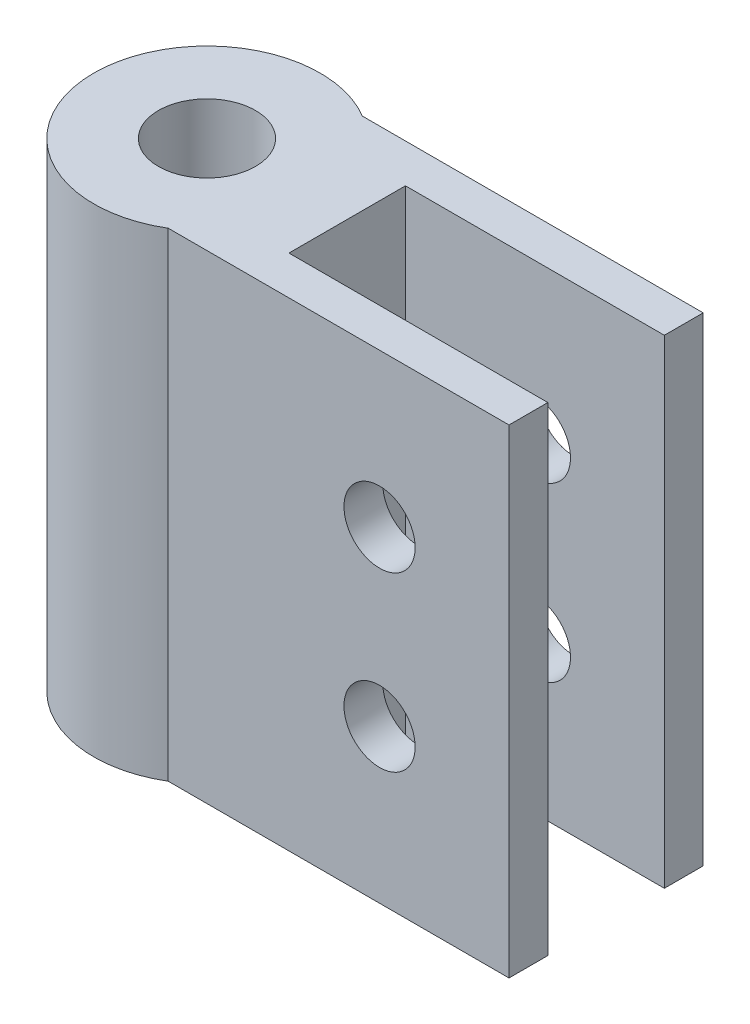
ISO-10303-21;
HEADER;
FILE_DESCRIPTION(('STEP AP214'),'2;1');
FILE_NAME('part.step','',(''),(''),'','','');
FILE_SCHEMA(('AUTOMOTIVE_DESIGN { 1 0 10303 214 1 1 1 1 }'));
ENDSEC;
DATA;
#1=APPLICATION_CONTEXT('core data for automotive mechanical design processes');
#2=APPLICATION_PROTOCOL_DEFINITION('international standard','automotive_design',2000,#1);
#3=PRODUCT_CONTEXT('',#1,'mechanical');
#4=PRODUCT('Part','Part','',(#3));
#5=PRODUCT_RELATED_PRODUCT_CATEGORY('part','',(#4));
#6=PRODUCT_DEFINITION_FORMATION('','',#4);
#7=PRODUCT_DEFINITION_CONTEXT('part definition',#1,'design');
#8=PRODUCT_DEFINITION('design','',#6,#7);
#9=PRODUCT_DEFINITION_SHAPE('','',#8);
#10=(LENGTH_UNIT() NAMED_UNIT(*) SI_UNIT(.MILLI.,.METRE.));
#11=(NAMED_UNIT(*) PLANE_ANGLE_UNIT() SI_UNIT($,.RADIAN.));
#12=(NAMED_UNIT(*) SI_UNIT($,.STERADIAN.) SOLID_ANGLE_UNIT());
#13=UNCERTAINTY_MEASURE_WITH_UNIT(LENGTH_MEASURE(1.E-05),#10,'distance_accuracy_value','');
#14=(GEOMETRIC_REPRESENTATION_CONTEXT(3) GLOBAL_UNCERTAINTY_ASSIGNED_CONTEXT((#13)) GLOBAL_UNIT_ASSIGNED_CONTEXT((#10,
#11,#12)) REPRESENTATION_CONTEXT('',''));
#15=CARTESIAN_POINT('',(0.,0.,0.));
#16=DIRECTION('',(0.,0.,1.));
#17=DIRECTION('',(1.,0.,0.));
#18=AXIS2_PLACEMENT_3D('',#15,#16,#17);
#19=CARTESIAN_POINT('',(18.5,-18.3575597506858,4.5));
#20=DIRECTION('',(1.,0.,0.));
#21=DIRECTION('',(0.,0.,-1.));
#22=AXIS2_PLACEMENT_3D('',#19,#20,#21);
#23=PLANE('',#22);
#24=DIRECTION('',(0.,1.,0.));
#25=VECTOR('',#24,1.);
#26=CARTESIAN_POINT('',(18.5,0.,2.7));
#27=LINE('',#26,#25);
#28=CARTESIAN_POINT('',(18.5,0.,2.7));
#29=VERTEX_POINT('',#28);
#30=CARTESIAN_POINT('',(18.5,22.2,2.7));
#31=VERTEX_POINT('',#30);
#32=EDGE_CURVE('E138',#29,#31,#27,.T.);
#33=ORIENTED_EDGE('',*,*,#32,.T.);
#34=DIRECTION('',(0.,0.,-1.));
#35=VECTOR('',#34,1.);
#36=CARTESIAN_POINT('',(18.5,22.2,4.5));
#37=LINE('',#36,#35);
#38=CARTESIAN_POINT('',(18.5,22.2,4.5));
#39=VERTEX_POINT('',#38);
#40=EDGE_CURVE('E151',#39,#31,#37,.T.);
#41=ORIENTED_EDGE('',*,*,#40,.F.);
#42=DIRECTION('',(0.,1.,0.));
#43=VECTOR('',#42,1.);
#44=CARTESIAN_POINT('',(18.5,-18.3575597506858,4.5));
#45=LINE('',#44,#43);
#46=CARTESIAN_POINT('',(18.5,0.,4.5));
#47=VERTEX_POINT('',#46);
#48=EDGE_CURVE('E157',#47,#39,#45,.T.);
#49=ORIENTED_EDGE('',*,*,#48,.F.);
#50=DIRECTION('',(0.,0.,1.));
#51=VECTOR('',#50,1.);
#52=CARTESIAN_POINT('',(18.5,0.,4.5));
#53=LINE('',#52,#51);
#54=EDGE_CURVE('E146',#29,#47,#53,.T.);
#55=ORIENTED_EDGE('',*,*,#54,.F.);
#56=EDGE_LOOP('',(#33,#41,#49,#55));
#57=FACE_BOUND('',#56,.T.);
#58=ADVANCED_FACE('F39',(#57),#23,.T.);
#59=CARTESIAN_POINT('',(0.,22.2,0.));
#60=DIRECTION('',(0.,1.,0.));
#61=DIRECTION('',(0.,0.,1.));
#62=AXIS2_PLACEMENT_3D('',#59,#60,#61);
#63=PLANE('',#62);
#64=DIRECTION('',(1.,0.,0.));
#65=VECTOR('',#64,1.);
#66=CARTESIAN_POINT('',(6.5,22.2,2.7));
#67=LINE('',#66,#65);
#68=CARTESIAN_POINT('',(6.5,22.2,2.7));
#69=VERTEX_POINT('',#68);
#70=EDGE_CURVE('E127',#69,#31,#67,.T.);
#71=ORIENTED_EDGE('',*,*,#70,.F.);
#72=DIRECTION('',(0.,0.,1.));
#73=VECTOR('',#72,1.);
#74=CARTESIAN_POINT('',(6.5,22.2,2.7));
#75=LINE('',#74,#73);
#76=CARTESIAN_POINT('',(6.5,22.2,-2.7));
#77=VERTEX_POINT('',#76);
#78=EDGE_CURVE('E129',#77,#69,#75,.T.);
#79=ORIENTED_EDGE('',*,*,#78,.F.);
#80=DIRECTION('',(-1.,0.,0.));
#81=VECTOR('',#80,1.);
#82=CARTESIAN_POINT('',(6.5,22.2,-2.7));
#83=LINE('',#82,#81);
#84=CARTESIAN_POINT('',(18.5,22.2,-2.7));
#85=VERTEX_POINT('',#84);
#86=EDGE_CURVE('E107',#85,#77,#83,.T.);
#87=ORIENTED_EDGE('',*,*,#86,.F.);
#88=CARTESIAN_POINT('',(18.5,22.2,-4.5));
#89=VERTEX_POINT('',#88);
#90=EDGE_CURVE('E150',#85,#89,#37,.T.);
#91=ORIENTED_EDGE('',*,*,#90,.T.);
#92=DIRECTION('',(-1.,0.,0.));
#93=VECTOR('',#92,1.);
#94=CARTESIAN_POINT('',(18.5,22.2,-4.5));
#95=LINE('',#94,#93);
#96=CARTESIAN_POINT('',(2.70416345659799,22.2,-4.5));
#97=VERTEX_POINT('',#96);
#98=EDGE_CURVE('E154',#89,#97,#95,.T.);
#99=ORIENTED_EDGE('',*,*,#98,.T.);
#100=CARTESIAN_POINT('',(0.,22.2,0.));
#101=DIRECTION('',(0.,1.,0.));
#102=DIRECTION('',(0.,0.,1.));
#103=AXIS2_PLACEMENT_3D('',#100,#101,#102);
#104=CIRCLE('',#103,5.25);
#105=CARTESIAN_POINT('',(2.70416345659799,22.2,4.5));
#106=VERTEX_POINT('',#105);
#107=EDGE_CURVE('E171',#97,#106,#104,.T.);
#108=ORIENTED_EDGE('',*,*,#107,.T.);
#109=DIRECTION('',(1.,0.,0.));
#110=VECTOR('',#109,1.);
#111=CARTESIAN_POINT('',(18.5,22.2,4.5));
#112=LINE('',#111,#110);
#113=EDGE_CURVE('E141',#106,#39,#112,.T.);
#114=ORIENTED_EDGE('',*,*,#113,.T.);
#115=ORIENTED_EDGE('',*,*,#40,.T.);
#116=EDGE_LOOP('',(#71,#79,#87,#91,#99,#108,#114,#115));
#117=FACE_BOUND('',#116,.T.);
#118=CARTESIAN_POINT('',(0.,22.2,0.));
#119=DIRECTION('',(0.,1.,0.));
#120=DIRECTION('',(0.,0.,1.));
#121=AXIS2_PLACEMENT_3D('',#118,#119,#120);
#122=CIRCLE('',#121,2.25);
#123=CARTESIAN_POINT('',(0.,22.2,2.25));
#124=VERTEX_POINT('',#123);
#125=EDGE_CURVE('E166',#124,#124,#122,.T.);
#126=ORIENTED_EDGE('',*,*,#125,.F.);
#127=EDGE_LOOP('',(#126));
#128=FACE_BOUND('',#127,.T.);
#129=ADVANCED_FACE('F218',(#117,#128),#63,.T.);
#130=CARTESIAN_POINT('',(0.,0.,0.));
#131=DIRECTION('',(0.,1.,0.));
#132=DIRECTION('',(0.,0.,1.));
#133=AXIS2_PLACEMENT_3D('',#130,#131,#132);
#134=PLANE('',#133);
#135=DIRECTION('',(0.,0.,1.));
#136=VECTOR('',#135,1.);
#137=CARTESIAN_POINT('',(6.5,0.,2.7));
#138=LINE('',#137,#136);
#139=CARTESIAN_POINT('',(6.5,0.,-2.7));
#140=VERTEX_POINT('',#139);
#141=CARTESIAN_POINT('',(6.5,0.,2.7));
#142=VERTEX_POINT('',#141);
#143=EDGE_CURVE('E115',#140,#142,#138,.T.);
#144=ORIENTED_EDGE('',*,*,#143,.T.);
#145=DIRECTION('',(1.,0.,0.));
#146=VECTOR('',#145,1.);
#147=CARTESIAN_POINT('',(6.5,0.,2.7));
#148=LINE('',#147,#146);
#149=EDGE_CURVE('E120',#142,#29,#148,.T.);
#150=ORIENTED_EDGE('',*,*,#149,.T.);
#151=ORIENTED_EDGE('',*,*,#54,.T.);
#152=DIRECTION('',(-1.,0.,0.));
#153=VECTOR('',#152,1.);
#154=CARTESIAN_POINT('',(18.5,0.,4.5));
#155=LINE('',#154,#153);
#156=CARTESIAN_POINT('',(2.70416345659799,0.,4.5));
#157=VERTEX_POINT('',#156);
#158=EDGE_CURVE('E148',#47,#157,#155,.T.);
#159=ORIENTED_EDGE('',*,*,#158,.T.);
#160=CARTESIAN_POINT('',(0.,0.,0.));
#161=DIRECTION('',(0.,1.,0.));
#162=DIRECTION('',(0.,0.,1.));
#163=AXIS2_PLACEMENT_3D('',#160,#161,#162);
#164=CIRCLE('',#163,5.25);
#165=CARTESIAN_POINT('',(2.70416345659799,0.,-4.5));
#166=VERTEX_POINT('',#165);
#167=EDGE_CURVE('E63',#166,#157,#164,.T.);
#168=ORIENTED_EDGE('',*,*,#167,.F.);
#169=DIRECTION('',(1.,0.,0.));
#170=VECTOR('',#169,1.);
#171=CARTESIAN_POINT('',(18.5,0.,-4.5));
#172=LINE('',#171,#170);
#173=CARTESIAN_POINT('',(18.5,0.,-4.5));
#174=VERTEX_POINT('',#173);
#175=EDGE_CURVE('E145',#166,#174,#172,.T.);
#176=ORIENTED_EDGE('',*,*,#175,.T.);
#177=CARTESIAN_POINT('',(18.5,0.,-2.7));
#178=VERTEX_POINT('',#177);
#179=EDGE_CURVE('E126',#174,#178,#53,.T.);
#180=ORIENTED_EDGE('',*,*,#179,.T.);
#181=DIRECTION('',(-1.,0.,0.));
#182=VECTOR('',#181,1.);
#183=CARTESIAN_POINT('',(6.5,0.,-2.7));
#184=LINE('',#183,#182);
#185=EDGE_CURVE('E56',#178,#140,#184,.T.);
#186=ORIENTED_EDGE('',*,*,#185,.T.);
#187=EDGE_LOOP('',(#144,#150,#151,#159,#168,#176,#180,#186));
#188=FACE_BOUND('',#187,.T.);
#189=CARTESIAN_POINT('',(0.,0.,0.));
#190=DIRECTION('',(0.,1.,0.));
#191=DIRECTION('',(0.,0.,1.));
#192=AXIS2_PLACEMENT_3D('',#189,#190,#191);
#193=CIRCLE('',#192,2.25);
#194=CARTESIAN_POINT('',(0.,0.,2.25));
#195=VERTEX_POINT('',#194);
#196=EDGE_CURVE('E165',#195,#195,#193,.T.);
#197=ORIENTED_EDGE('',*,*,#196,.T.);
#198=EDGE_LOOP('',(#197));
#199=FACE_BOUND('',#198,.T.);
#200=ADVANCED_FACE('F123',(#188,#199),#134,.F.);
#201=CARTESIAN_POINT('',(0.,22.2,0.));
#202=DIRECTION('',(0.,-1.,0.));
#203=DIRECTION('',(0.,0.,-1.));
#204=AXIS2_PLACEMENT_3D('',#201,#202,#203);
#205=CYLINDRICAL_SURFACE('',#204,5.25);
#206=ORIENTED_EDGE('',*,*,#107,.F.);
#207=DIRECTION('',(0.,-1.,0.));
#208=VECTOR('',#207,1.);
#209=CARTESIAN_POINT('',(2.70416345659799,22.2,-4.5));
#210=LINE('',#209,#208);
#211=EDGE_CURVE('E11',#97,#166,#210,.T.);
#212=ORIENTED_EDGE('',*,*,#211,.T.);
#213=ORIENTED_EDGE('',*,*,#167,.T.);
#214=DIRECTION('',(0.,-1.,0.));
#215=VECTOR('',#214,1.);
#216=CARTESIAN_POINT('',(2.70416345659799,22.2,4.5));
#217=LINE('',#216,#215);
#218=EDGE_CURVE('E48',#157,#106,#217,.F.);
#219=ORIENTED_EDGE('',*,*,#218,.T.);
#220=EDGE_LOOP('',(#206,#212,#213,#219));
#221=FACE_BOUND('',#220,.T.);
#222=ADVANCED_FACE('F41',(#221),#205,.T.);
#223=CARTESIAN_POINT('',(0.,22.2,0.));
#224=DIRECTION('',(0.,-1.,0.));
#225=DIRECTION('',(0.,0.,-1.));
#226=AXIS2_PLACEMENT_3D('',#223,#224,#225);
#227=CYLINDRICAL_SURFACE('',#226,2.25);
#228=ORIENTED_EDGE('',*,*,#125,.T.);
#229=EDGE_LOOP('',(#228));
#230=FACE_BOUND('',#229,.T.);
#231=ORIENTED_EDGE('',*,*,#196,.F.);
#232=EDGE_LOOP('',(#231));
#233=FACE_BOUND('',#232,.T.);
#234=ADVANCED_FACE('F259',(#230,#233),#227,.F.);
#235=CARTESIAN_POINT('',(18.5,-18.3575597506858,-4.5));
#236=DIRECTION('',(0.,0.,-1.));
#237=DIRECTION('',(-1.,0.,0.));
#238=AXIS2_PLACEMENT_3D('',#235,#236,#237);
#239=PLANE('',#238);
#240=CARTESIAN_POINT('',(12.5,15.1,-4.5));
#241=DIRECTION('',(0.,0.,-1.));
#242=DIRECTION('',(-1.,0.,0.));
#243=AXIS2_PLACEMENT_3D('',#240,#241,#242);
#244=CIRCLE('',#243,1.65);
#245=CARTESIAN_POINT('',(10.85,15.1,-4.5));
#246=VERTEX_POINT('',#245);
#247=EDGE_CURVE('E132',#246,#246,#244,.T.);
#248=ORIENTED_EDGE('',*,*,#247,.F.);
#249=EDGE_LOOP('',(#248));
#250=FACE_BOUND('',#249,.T.);
#251=CARTESIAN_POINT('',(12.5,7.1,-4.5));
#252=DIRECTION('',(0.,0.,-1.));
#253=DIRECTION('',(-1.,0.,0.));
#254=AXIS2_PLACEMENT_3D('',#251,#252,#253);
#255=CIRCLE('',#254,1.65);
#256=CARTESIAN_POINT('',(10.85,7.1,-4.5));
#257=VERTEX_POINT('',#256);
#258=EDGE_CURVE('E182',#257,#257,#255,.T.);
#259=ORIENTED_EDGE('',*,*,#258,.F.);
#260=EDGE_LOOP('',(#259));
#261=FACE_BOUND('',#260,.T.);
#262=ORIENTED_EDGE('',*,*,#211,.F.);
#263=ORIENTED_EDGE('',*,*,#98,.F.);
#264=DIRECTION('',(0.,1.,0.));
#265=VECTOR('',#264,1.);
#266=CARTESIAN_POINT('',(18.5,-18.3575597506858,-4.5));
#267=LINE('',#266,#265);
#268=EDGE_CURVE('E158',#174,#89,#267,.T.);
#269=ORIENTED_EDGE('',*,*,#268,.F.);
#270=ORIENTED_EDGE('',*,*,#175,.F.);
#271=EDGE_LOOP('',(#262,#263,#269,#270));
#272=FACE_BOUND('',#271,.T.);
#273=ADVANCED_FACE('F241',(#250,#261,#272),#239,.T.);
#274=CARTESIAN_POINT('',(18.5,-18.3575597506858,4.5));
#275=DIRECTION('',(0.,0.,1.));
#276=DIRECTION('',(1.,0.,0.));
#277=AXIS2_PLACEMENT_3D('',#274,#275,#276);
#278=PLANE('',#277);
#279=CARTESIAN_POINT('',(12.5,15.1,4.5));
#280=DIRECTION('',(0.,0.,1.));
#281=DIRECTION('',(1.,0.,0.));
#282=AXIS2_PLACEMENT_3D('',#279,#280,#281);
#283=CIRCLE('',#282,1.65);
#284=CARTESIAN_POINT('',(14.15,15.1,4.5));
#285=VERTEX_POINT('',#284);
#286=EDGE_CURVE('E178',#285,#285,#283,.T.);
#287=ORIENTED_EDGE('',*,*,#286,.F.);
#288=EDGE_LOOP('',(#287));
#289=FACE_BOUND('',#288,.T.);
#290=CARTESIAN_POINT('',(12.5,7.1,4.5));
#291=DIRECTION('',(0.,0.,1.));
#292=DIRECTION('',(-1.,0.,0.));
#293=AXIS2_PLACEMENT_3D('',#290,#291,#292);
#294=CIRCLE('',#293,1.65);
#295=CARTESIAN_POINT('',(10.85,7.1,4.5));
#296=VERTEX_POINT('',#295);
#297=EDGE_CURVE('E185',#296,#296,#294,.T.);
#298=ORIENTED_EDGE('',*,*,#297,.F.);
#299=EDGE_LOOP('',(#298));
#300=FACE_BOUND('',#299,.T.);
#301=ORIENTED_EDGE('',*,*,#218,.F.);
#302=ORIENTED_EDGE('',*,*,#158,.F.);
#303=ORIENTED_EDGE('',*,*,#48,.T.);
#304=ORIENTED_EDGE('',*,*,#113,.F.);
#305=EDGE_LOOP('',(#301,#302,#303,#304));
#306=FACE_BOUND('',#305,.T.);
#307=ADVANCED_FACE('F232',(#289,#300,#306),#278,.T.);
#308=DIRECTION('',(0.,1.,0.));
#309=VECTOR('',#308,1.);
#310=CARTESIAN_POINT('',(18.5,0.,-2.7));
#311=LINE('',#310,#309);
#312=EDGE_CURVE('E112',#178,#85,#311,.T.);
#313=ORIENTED_EDGE('',*,*,#312,.F.);
#314=ORIENTED_EDGE('',*,*,#179,.F.);
#315=ORIENTED_EDGE('',*,*,#268,.T.);
#316=ORIENTED_EDGE('',*,*,#90,.F.);
#317=EDGE_LOOP('',(#313,#314,#315,#316));
#318=FACE_BOUND('',#317,.T.);
#319=ADVANCED_FACE('F221',(#318),#23,.T.);
#320=CARTESIAN_POINT('',(6.5,0.,2.7));
#321=DIRECTION('',(0.,0.,1.));
#322=DIRECTION('',(1.,0.,0.));
#323=AXIS2_PLACEMENT_3D('',#320,#321,#322);
#324=PLANE('',#323);
#325=CARTESIAN_POINT('',(12.5,15.1,2.7));
#326=DIRECTION('',(0.,0.,1.));
#327=DIRECTION('',(1.,0.,0.));
#328=AXIS2_PLACEMENT_3D('',#325,#326,#327);
#329=CIRCLE('',#328,1.65);
#330=CARTESIAN_POINT('',(14.15,15.1,2.7));
#331=VERTEX_POINT('',#330);
#332=EDGE_CURVE('E193',#331,#331,#329,.T.);
#333=ORIENTED_EDGE('',*,*,#332,.T.);
#334=EDGE_LOOP('',(#333));
#335=FACE_BOUND('',#334,.T.);
#336=CARTESIAN_POINT('',(12.5,7.1,2.7));
#337=DIRECTION('',(0.,0.,1.));
#338=DIRECTION('',(1.,0.,0.));
#339=AXIS2_PLACEMENT_3D('',#336,#337,#338);
#340=CIRCLE('',#339,1.65);
#341=CARTESIAN_POINT('',(14.15,7.1,2.7));
#342=VERTEX_POINT('',#341);
#343=EDGE_CURVE('E177',#342,#342,#340,.T.);
#344=ORIENTED_EDGE('',*,*,#343,.T.);
#345=EDGE_LOOP('',(#344));
#346=FACE_BOUND('',#345,.T.);
#347=ORIENTED_EDGE('',*,*,#70,.T.);
#348=ORIENTED_EDGE('',*,*,#32,.F.);
#349=ORIENTED_EDGE('',*,*,#149,.F.);
#350=DIRECTION('',(0.,1.,0.));
#351=VECTOR('',#350,1.);
#352=CARTESIAN_POINT('',(6.5,0.,2.7));
#353=LINE('',#352,#351);
#354=EDGE_CURVE('E111',#142,#69,#353,.T.);
#355=ORIENTED_EDGE('',*,*,#354,.T.);
#356=EDGE_LOOP('',(#347,#348,#349,#355));
#357=FACE_BOUND('',#356,.T.);
#358=ADVANCED_FACE('F231',(#335,#346,#357),#324,.F.);
#359=CARTESIAN_POINT('',(6.5,0.,2.7));
#360=DIRECTION('',(-1.,0.,0.));
#361=DIRECTION('',(0.,0.,1.));
#362=AXIS2_PLACEMENT_3D('',#359,#360,#361);
#363=PLANE('',#362);
#364=ORIENTED_EDGE('',*,*,#78,.T.);
#365=ORIENTED_EDGE('',*,*,#354,.F.);
#366=ORIENTED_EDGE('',*,*,#143,.F.);
#367=DIRECTION('',(0.,1.,0.));
#368=VECTOR('',#367,1.);
#369=CARTESIAN_POINT('',(6.5,0.,-2.7));
#370=LINE('',#369,#368);
#371=EDGE_CURVE('E103',#140,#77,#370,.T.);
#372=ORIENTED_EDGE('',*,*,#371,.T.);
#373=EDGE_LOOP('',(#364,#365,#366,#372));
#374=FACE_BOUND('',#373,.T.);
#375=ADVANCED_FACE('F116',(#374),#363,.F.);
#376=CARTESIAN_POINT('',(6.5,0.,-2.7));
#377=DIRECTION('',(0.,0.,-1.));
#378=DIRECTION('',(-1.,0.,0.));
#379=AXIS2_PLACEMENT_3D('',#376,#377,#378);
#380=PLANE('',#379);
#381=CARTESIAN_POINT('',(12.5,15.1,-2.7));
#382=DIRECTION('',(0.,0.,-1.));
#383=DIRECTION('',(-1.,0.,0.));
#384=AXIS2_PLACEMENT_3D('',#381,#382,#383);
#385=CIRCLE('',#384,1.65);
#386=CARTESIAN_POINT('',(10.85,15.1,-2.7));
#387=VERTEX_POINT('',#386);
#388=EDGE_CURVE('E43',#387,#387,#385,.T.);
#389=ORIENTED_EDGE('',*,*,#388,.T.);
#390=EDGE_LOOP('',(#389));
#391=FACE_BOUND('',#390,.T.);
#392=CARTESIAN_POINT('',(12.5,7.1,-2.7));
#393=DIRECTION('',(0.,0.,-1.));
#394=DIRECTION('',(-1.,0.,0.));
#395=AXIS2_PLACEMENT_3D('',#392,#393,#394);
#396=CIRCLE('',#395,1.65);
#397=CARTESIAN_POINT('',(10.85,7.1,-2.7));
#398=VERTEX_POINT('',#397);
#399=EDGE_CURVE('E175',#398,#398,#396,.T.);
#400=ORIENTED_EDGE('',*,*,#399,.T.);
#401=EDGE_LOOP('',(#400));
#402=FACE_BOUND('',#401,.T.);
#403=ORIENTED_EDGE('',*,*,#86,.T.);
#404=ORIENTED_EDGE('',*,*,#371,.F.);
#405=ORIENTED_EDGE('',*,*,#185,.F.);
#406=ORIENTED_EDGE('',*,*,#312,.T.);
#407=EDGE_LOOP('',(#403,#404,#405,#406));
#408=FACE_BOUND('',#407,.T.);
#409=ADVANCED_FACE('F105',(#391,#402,#408),#380,.F.);
#410=CARTESIAN_POINT('',(12.5,7.1,-17.5));
#411=DIRECTION('',(0.,0.,1.));
#412=DIRECTION('',(1.,0.,0.));
#413=AXIS2_PLACEMENT_3D('',#410,#411,#412);
#414=CYLINDRICAL_SURFACE('',#413,1.65);
#415=ORIENTED_EDGE('',*,*,#258,.T.);
#416=EDGE_LOOP('',(#415));
#417=FACE_BOUND('',#416,.T.);
#418=ORIENTED_EDGE('',*,*,#399,.F.);
#419=EDGE_LOOP('',(#418));
#420=FACE_BOUND('',#419,.T.);
#421=ADVANCED_FACE('F205',(#417,#420),#414,.F.);
#422=CARTESIAN_POINT('',(12.5,15.1,-17.5));
#423=DIRECTION('',(0.,0.,1.));
#424=DIRECTION('',(1.,0.,0.));
#425=AXIS2_PLACEMENT_3D('',#422,#423,#424);
#426=CYLINDRICAL_SURFACE('',#425,1.65);
#427=ORIENTED_EDGE('',*,*,#247,.T.);
#428=EDGE_LOOP('',(#427));
#429=FACE_BOUND('',#428,.T.);
#430=ORIENTED_EDGE('',*,*,#388,.F.);
#431=EDGE_LOOP('',(#430));
#432=FACE_BOUND('',#431,.T.);
#433=ADVANCED_FACE('F202',(#429,#432),#426,.F.);
#434=ORIENTED_EDGE('',*,*,#297,.T.);
#435=EDGE_LOOP('',(#434));
#436=FACE_BOUND('',#435,.T.);
#437=ORIENTED_EDGE('',*,*,#343,.F.);
#438=EDGE_LOOP('',(#437));
#439=FACE_BOUND('',#438,.T.);
#440=ADVANCED_FACE('F204',(#436,#439),#414,.F.);
#441=ORIENTED_EDGE('',*,*,#286,.T.);
#442=EDGE_LOOP('',(#441));
#443=FACE_BOUND('',#442,.T.);
#444=ORIENTED_EDGE('',*,*,#332,.F.);
#445=EDGE_LOOP('',(#444));
#446=FACE_BOUND('',#445,.T.);
#447=ADVANCED_FACE('F208',(#443,#446),#426,.F.);
#448=CLOSED_SHELL('',(#58,#129,#200,#222,#234,#273,#307,#319,#358,#375,#409,#421,#433,#440,#447));
#449=MANIFOLD_SOLID_BREP('B2',#448);
#450=ADVANCED_BREP_SHAPE_REPRESENTATION('',(#18,#449),#14);
#451=SHAPE_DEFINITION_REPRESENTATION(#9,#450);
ENDSEC;
END-ISO-10303-21;
